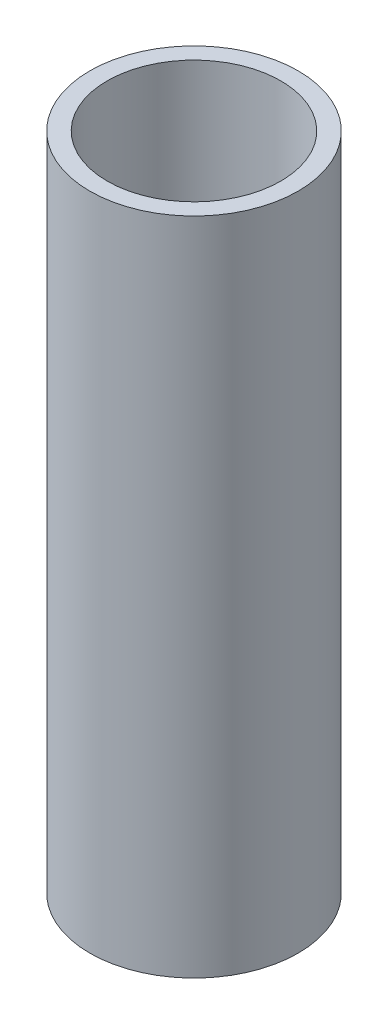
ISO-10303-21;
HEADER;
FILE_DESCRIPTION(('STEP AP214'),'2;1');
FILE_NAME('part.step','',(''),(''),'','','');
FILE_SCHEMA(('AUTOMOTIVE_DESIGN { 1 0 10303 214 1 1 1 1 }'));
ENDSEC;
DATA;
#1=APPLICATION_CONTEXT('core data for automotive mechanical design processes');
#2=APPLICATION_PROTOCOL_DEFINITION('international standard','automotive_design',2000,#1);
#3=PRODUCT_CONTEXT('',#1,'mechanical');
#4=PRODUCT('Part','Part','',(#3));
#5=PRODUCT_RELATED_PRODUCT_CATEGORY('part','',(#4));
#6=PRODUCT_DEFINITION_FORMATION('','',#4);
#7=PRODUCT_DEFINITION_CONTEXT('part definition',#1,'design');
#8=PRODUCT_DEFINITION('design','',#6,#7);
#9=PRODUCT_DEFINITION_SHAPE('','',#8);
#10=(LENGTH_UNIT() NAMED_UNIT(*) SI_UNIT(.MILLI.,.METRE.));
#11=(NAMED_UNIT(*) PLANE_ANGLE_UNIT() SI_UNIT($,.RADIAN.));
#12=(NAMED_UNIT(*) SI_UNIT($,.STERADIAN.) SOLID_ANGLE_UNIT());
#13=UNCERTAINTY_MEASURE_WITH_UNIT(LENGTH_MEASURE(1.E-05),#10,'distance_accuracy_value','');
#14=(GEOMETRIC_REPRESENTATION_CONTEXT(3) GLOBAL_UNCERTAINTY_ASSIGNED_CONTEXT((#13)) GLOBAL_UNIT_ASSIGNED_CONTEXT((#10,
#11,#12)) REPRESENTATION_CONTEXT('',''));
#15=CARTESIAN_POINT('',(0.,0.,0.));
#16=DIRECTION('',(0.,0.,1.));
#17=DIRECTION('',(1.,0.,0.));
#18=AXIS2_PLACEMENT_3D('',#15,#16,#17);
#19=CARTESIAN_POINT('',(0.,38.,0.));
#20=DIRECTION('',(0.,-1.,0.));
#21=DIRECTION('',(0.,0.,-1.));
#22=AXIS2_PLACEMENT_3D('',#19,#20,#21);
#23=CYLINDRICAL_SURFACE('',#22,6.);
#24=CARTESIAN_POINT('',(0.,38.,0.));
#25=DIRECTION('',(0.,1.,0.));
#26=DIRECTION('',(0.,0.,1.));
#27=AXIS2_PLACEMENT_3D('',#24,#25,#26);
#28=CIRCLE('',#27,6.);
#29=CARTESIAN_POINT('',(0.,38.,6.));
#30=VERTEX_POINT('',#29);
#31=EDGE_CURVE('E10',#30,#30,#28,.T.);
#32=ORIENTED_EDGE('',*,*,#31,.F.);
#33=EDGE_LOOP('',(#32));
#34=FACE_BOUND('',#33,.T.);
#35=CARTESIAN_POINT('',(0.,0.,0.));
#36=DIRECTION('',(0.,1.,0.));
#37=DIRECTION('',(0.,0.,1.));
#38=AXIS2_PLACEMENT_3D('',#35,#36,#37);
#39=CIRCLE('',#38,6.);
#40=CARTESIAN_POINT('',(0.,0.,6.));
#41=VERTEX_POINT('',#40);
#42=EDGE_CURVE('E40',#41,#41,#39,.T.);
#43=ORIENTED_EDGE('',*,*,#42,.T.);
#44=EDGE_LOOP('',(#43));
#45=FACE_BOUND('',#44,.T.);
#46=ADVANCED_FACE('F37',(#34,#45),#23,.T.);
#47=CARTESIAN_POINT('',(0.,38.,0.));
#48=DIRECTION('',(0.,1.,0.));
#49=DIRECTION('',(0.,0.,1.));
#50=AXIS2_PLACEMENT_3D('',#47,#48,#49);
#51=PLANE('',#50);
#52=CARTESIAN_POINT('',(0.,38.,0.));
#53=DIRECTION('',(0.,1.,0.));
#54=DIRECTION('',(0.,0.,1.));
#55=AXIS2_PLACEMENT_3D('',#52,#53,#54);
#56=CIRCLE('',#55,5.);
#57=CARTESIAN_POINT('',(0.,38.,5.));
#58=VERTEX_POINT('',#57);
#59=EDGE_CURVE('E51',#58,#58,#56,.T.);
#60=ORIENTED_EDGE('',*,*,#59,.F.);
#61=EDGE_LOOP('',(#60));
#62=FACE_BOUND('',#61,.T.);
#63=ORIENTED_EDGE('',*,*,#31,.T.);
#64=EDGE_LOOP('',(#63));
#65=FACE_BOUND('',#64,.T.);
#66=ADVANCED_FACE('F68',(#62,#65),#51,.T.);
#67=CARTESIAN_POINT('',(0.,0.,0.));
#68=DIRECTION('',(0.,1.,0.));
#69=DIRECTION('',(0.,0.,1.));
#70=AXIS2_PLACEMENT_3D('',#67,#68,#69);
#71=PLANE('',#70);
#72=CARTESIAN_POINT('',(0.,0.,0.));
#73=DIRECTION('',(0.,1.,0.));
#74=DIRECTION('',(0.,0.,1.));
#75=AXIS2_PLACEMENT_3D('',#72,#73,#74);
#76=CIRCLE('',#75,5.);
#77=CARTESIAN_POINT('',(0.,0.,5.));
#78=VERTEX_POINT('',#77);
#79=EDGE_CURVE('E49',#78,#78,#76,.T.);
#80=ORIENTED_EDGE('',*,*,#79,.T.);
#81=EDGE_LOOP('',(#80));
#82=FACE_BOUND('',#81,.T.);
#83=ORIENTED_EDGE('',*,*,#42,.F.);
#84=EDGE_LOOP('',(#83));
#85=FACE_BOUND('',#84,.T.);
#86=ADVANCED_FACE('F59',(#82,#85),#71,.F.);
#87=CARTESIAN_POINT('',(0.,0.,0.));
#88=DIRECTION('',(0.,1.,0.));
#89=DIRECTION('',(0.,0.,1.));
#90=AXIS2_PLACEMENT_3D('',#87,#88,#89);
#91=CYLINDRICAL_SURFACE('',#90,5.);
#92=ORIENTED_EDGE('',*,*,#79,.F.);
#93=EDGE_LOOP('',(#92));
#94=FACE_BOUND('',#93,.T.);
#95=ORIENTED_EDGE('',*,*,#59,.T.);
#96=EDGE_LOOP('',(#95));
#97=FACE_BOUND('',#96,.T.);
#98=ADVANCED_FACE('F62',(#94,#97),#91,.F.);
#99=CLOSED_SHELL('',(#46,#66,#86,#98));
#100=MANIFOLD_SOLID_BREP('B2',#99);
#101=ADVANCED_BREP_SHAPE_REPRESENTATION('',(#18,#100),#14);
#102=SHAPE_DEFINITION_REPRESENTATION(#9,#101);
ENDSEC;
END-ISO-10303-21;
